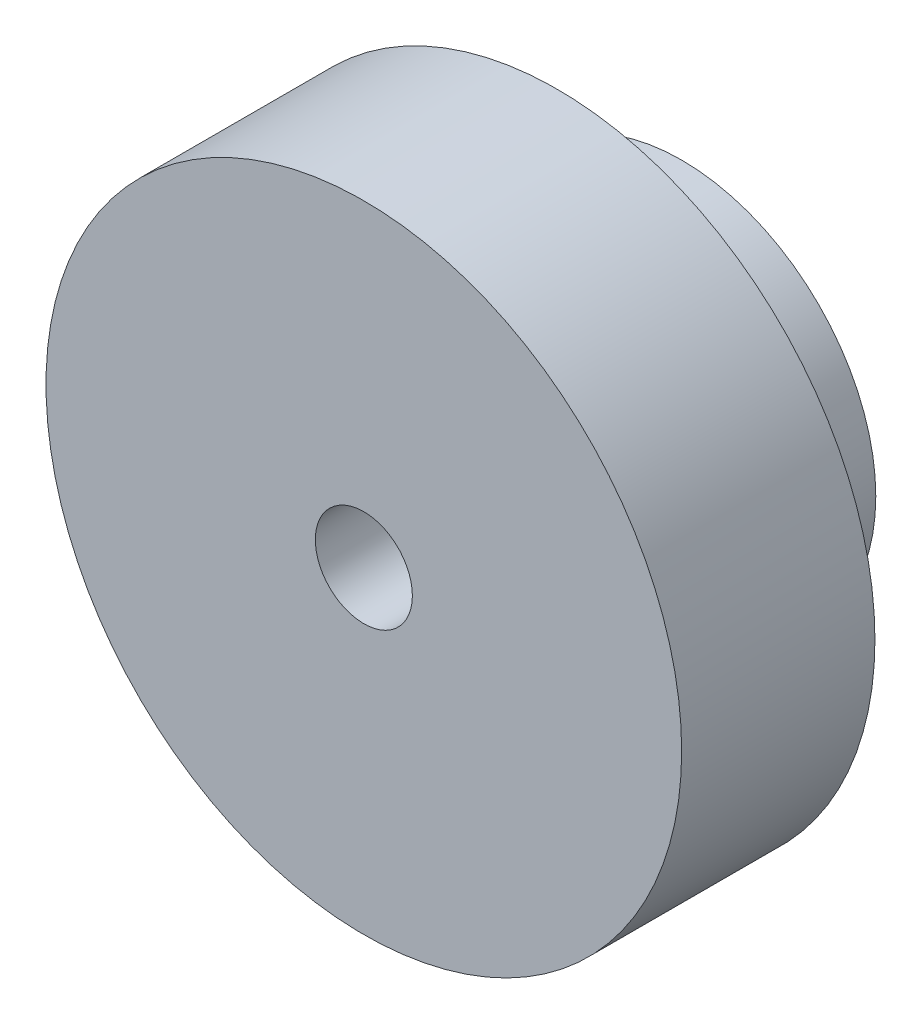
ISO-10303-21;
HEADER;
FILE_DESCRIPTION(('STEP AP214'),'2;1');
FILE_NAME('part.step','',(''),(''),'','','');
FILE_SCHEMA(('AUTOMOTIVE_DESIGN { 1 0 10303 214 1 1 1 1 }'));
ENDSEC;
DATA;
#1=APPLICATION_CONTEXT('core data for automotive mechanical design processes');
#2=APPLICATION_PROTOCOL_DEFINITION('international standard','automotive_design',2000,#1);
#3=PRODUCT_CONTEXT('',#1,'mechanical');
#4=PRODUCT('Part','Part','',(#3));
#5=PRODUCT_RELATED_PRODUCT_CATEGORY('part','',(#4));
#6=PRODUCT_DEFINITION_FORMATION('','',#4);
#7=PRODUCT_DEFINITION_CONTEXT('part definition',#1,'design');
#8=PRODUCT_DEFINITION('design','',#6,#7);
#9=PRODUCT_DEFINITION_SHAPE('','',#8);
#10=(LENGTH_UNIT() NAMED_UNIT(*) SI_UNIT(.MILLI.,.METRE.));
#11=(NAMED_UNIT(*) PLANE_ANGLE_UNIT() SI_UNIT($,.RADIAN.));
#12=(NAMED_UNIT(*) SI_UNIT($,.STERADIAN.) SOLID_ANGLE_UNIT());
#13=UNCERTAINTY_MEASURE_WITH_UNIT(LENGTH_MEASURE(1.E-05),#10,'distance_accuracy_value','');
#14=(GEOMETRIC_REPRESENTATION_CONTEXT(3) GLOBAL_UNCERTAINTY_ASSIGNED_CONTEXT((#13)) GLOBAL_UNIT_ASSIGNED_CONTEXT((#10,
#11,#12)) REPRESENTATION_CONTEXT('',''));
#15=CARTESIAN_POINT('',(0.,0.,0.));
#16=DIRECTION('',(0.,0.,1.));
#17=DIRECTION('',(1.,0.,0.));
#18=AXIS2_PLACEMENT_3D('',#15,#16,#17);
#19=CARTESIAN_POINT('',(0.,0.,0.));
#20=DIRECTION('',(0.,0.,1.));
#21=DIRECTION('',(1.,0.,0.));
#22=AXIS2_PLACEMENT_3D('',#19,#20,#21);
#23=PLANE('',#22);
#24=CARTESIAN_POINT('',(0.,0.,0.));
#25=DIRECTION('',(0.,0.,1.));
#26=DIRECTION('',(1.,0.,0.));
#27=AXIS2_PLACEMENT_3D('',#24,#25,#26);
#28=CIRCLE('',#27,9.398);
#29=CARTESIAN_POINT('',(9.398,0.,0.));
#30=VERTEX_POINT('',#29);
#31=EDGE_CURVE('E117',#30,#30,#28,.T.);
#32=ORIENTED_EDGE('',*,*,#31,.F.);
#33=EDGE_LOOP('',(#32));
#34=FACE_BOUND('',#33,.T.);
#35=CARTESIAN_POINT('',(0.,0.,0.));
#36=DIRECTION('',(0.,0.,1.));
#37=DIRECTION('',(1.,0.,0.));
#38=AXIS2_PLACEMENT_3D('',#35,#36,#37);
#39=CIRCLE('',#38,5.7404);
#40=CARTESIAN_POINT('',(5.7404,0.,0.));
#41=VERTEX_POINT('',#40);
#42=EDGE_CURVE('E11',#41,#41,#39,.F.);
#43=ORIENTED_EDGE('',*,*,#42,.F.);
#44=EDGE_LOOP('',(#43));
#45=FACE_BOUND('',#44,.T.);
#46=ADVANCED_FACE('F33',(#34,#45),#23,.F.);
#47=CARTESIAN_POINT('',(0.,0.,5.715));
#48=DIRECTION('',(0.,0.,1.));
#49=DIRECTION('',(1.,0.,0.));
#50=AXIS2_PLACEMENT_3D('',#47,#48,#49);
#51=PLANE('',#50);
#52=CARTESIAN_POINT('',(0.,0.,5.715));
#53=DIRECTION('',(0.,0.,1.));
#54=DIRECTION('',(1.,0.,0.));
#55=AXIS2_PLACEMENT_3D('',#52,#53,#54);
#56=CIRCLE('',#55,9.398);
#57=CARTESIAN_POINT('',(9.398,0.,5.715));
#58=VERTEX_POINT('',#57);
#59=EDGE_CURVE('E41',#58,#58,#56,.T.);
#60=ORIENTED_EDGE('',*,*,#59,.T.);
#61=EDGE_LOOP('',(#60));
#62=FACE_BOUND('',#61,.T.);
#63=CARTESIAN_POINT('',(0.,0.,5.715));
#64=DIRECTION('',(0.,0.,1.));
#65=DIRECTION('',(1.,0.,0.));
#66=AXIS2_PLACEMENT_3D('',#63,#64,#65);
#67=CIRCLE('',#66,1.4351);
#68=CARTESIAN_POINT('',(1.4351,0.,5.715));
#69=VERTEX_POINT('',#68);
#70=EDGE_CURVE('E114',#69,#69,#67,.T.);
#71=ORIENTED_EDGE('',*,*,#70,.F.);
#72=EDGE_LOOP('',(#71));
#73=FACE_BOUND('',#72,.T.);
#74=ADVANCED_FACE('F127',(#62,#73),#51,.T.);
#75=DIRECTION('',(-0.0568059995069936,0.998385235477775,0.));
#76=VECTOR('',#75,1.);
#77=CARTESIAN_POINT('',(-3.76439766377805,3.35908654150401,0.));
#78=LINE('',#77,#76);
#79=CARTESIAN_POINT('',(-3.35973996839416,-3.75291345849599,0.));
#80=VERTEX_POINT('',#79);
#81=CARTESIAN_POINT('',(-3.76439766377805,3.35908654150401,0.));
#82=VERTEX_POINT('',#81);
#83=EDGE_CURVE('E82',#80,#82,#78,.T.);
#84=ORIENTED_EDGE('',*,*,#83,.T.);
#85=DIRECTION('',(0.998385235477775,0.056805999506994,0.));
#86=VECTOR('',#85,1.);
#87=CARTESIAN_POINT('',(3.34760233622194,3.7637442368879,0.));
#88=LINE('',#87,#86);
#89=CARTESIAN_POINT('',(3.34760233622194,3.7637442368879,0.));
#90=VERTEX_POINT('',#89);
#91=EDGE_CURVE('E100',#82,#90,#88,.T.);
#92=ORIENTED_EDGE('',*,*,#91,.T.);
#93=DIRECTION('',(0.0568059995069942,-0.998385235477774,0.));
#94=VECTOR('',#93,1.);
#95=CARTESIAN_POINT('',(3.75226003160584,-3.3482557631121,0.));
#96=LINE('',#95,#94);
#97=CARTESIAN_POINT('',(3.75226003160584,-3.3482557631121,0.));
#98=VERTEX_POINT('',#97);
#99=EDGE_CURVE('E88',#90,#98,#96,.T.);
#100=ORIENTED_EDGE('',*,*,#99,.T.);
#101=DIRECTION('',(-0.998385235477775,-0.0568059995069939,0.));
#102=VECTOR('',#101,1.);
#103=CARTESIAN_POINT('',(-3.35973996839416,-3.75291345849599,0.));
#104=LINE('',#103,#102);
#105=EDGE_CURVE('E103',#98,#80,#104,.T.);
#106=ORIENTED_EDGE('',*,*,#105,.T.);
#107=EDGE_LOOP('',(#84,#92,#100,#106));
#108=FACE_BOUND('',#107,.T.);
#109=CARTESIAN_POINT('',(0.,0.,0.));
#110=DIRECTION('',(0.,0.,1.));
#111=DIRECTION('',(1.,0.,0.));
#112=AXIS2_PLACEMENT_3D('',#109,#110,#111);
#113=CIRCLE('',#112,1.4351);
#114=CARTESIAN_POINT('',(1.4351,0.,0.));
#115=VERTEX_POINT('',#114);
#116=EDGE_CURVE('E113',#115,#115,#113,.T.);
#117=ORIENTED_EDGE('',*,*,#116,.T.);
#118=EDGE_LOOP('',(#117));
#119=FACE_BOUND('',#118,.T.);
#120=ADVANCED_FACE('F128',(#108,#119),#23,.F.);
#121=CARTESIAN_POINT('',(0.,0.,5.715));
#122=DIRECTION('',(0.,0.,-1.));
#123=DIRECTION('',(-1.,0.,0.));
#124=AXIS2_PLACEMENT_3D('',#121,#122,#123);
#125=CYLINDRICAL_SURFACE('',#124,9.398);
#126=ORIENTED_EDGE('',*,*,#59,.F.);
#127=EDGE_LOOP('',(#126));
#128=FACE_BOUND('',#127,.T.);
#129=ORIENTED_EDGE('',*,*,#31,.T.);
#130=EDGE_LOOP('',(#129));
#131=FACE_BOUND('',#130,.T.);
#132=ADVANCED_FACE('F35',(#128,#131),#125,.T.);
#133=CARTESIAN_POINT('',(0.,0.,5.715));
#134=DIRECTION('',(0.,0.,-1.));
#135=DIRECTION('',(-1.,0.,0.));
#136=AXIS2_PLACEMENT_3D('',#133,#134,#135);
#137=CYLINDRICAL_SURFACE('',#136,1.4351);
#138=ORIENTED_EDGE('',*,*,#70,.T.);
#139=EDGE_LOOP('',(#138));
#140=FACE_BOUND('',#139,.T.);
#141=ORIENTED_EDGE('',*,*,#116,.F.);
#142=EDGE_LOOP('',(#141));
#143=FACE_BOUND('',#142,.T.);
#144=ADVANCED_FACE('F140',(#140,#143),#137,.F.);
#145=CARTESIAN_POINT('',(0.,0.,-3.683));
#146=DIRECTION('',(0.,0.,-1.));
#147=DIRECTION('',(-1.,0.,0.));
#148=AXIS2_PLACEMENT_3D('',#145,#146,#147);
#149=PLANE('',#148);
#150=CARTESIAN_POINT('',(0.,0.,-3.683));
#151=DIRECTION('',(0.,0.,-1.));
#152=DIRECTION('',(-1.,0.,0.));
#153=AXIS2_PLACEMENT_3D('',#150,#151,#152);
#154=CIRCLE('',#153,5.7404);
#155=CARTESIAN_POINT('',(-5.7404,0.,-3.683));
#156=VERTEX_POINT('',#155);
#157=EDGE_CURVE('E89',#156,#156,#154,.T.);
#158=ORIENTED_EDGE('',*,*,#157,.T.);
#159=EDGE_LOOP('',(#158));
#160=FACE_BOUND('',#159,.T.);
#161=DIRECTION('',(0.0568059995069942,-0.998385235477774,0.));
#162=VECTOR('',#161,1.);
#163=CARTESIAN_POINT('',(3.75226003160584,-3.3482557631121,-3.683));
#164=LINE('',#163,#162);
#165=CARTESIAN_POINT('',(3.34760233622194,3.7637442368879,-3.683));
#166=VERTEX_POINT('',#165);
#167=CARTESIAN_POINT('',(3.75226003160584,-3.3482557631121,-3.683));
#168=VERTEX_POINT('',#167);
#169=EDGE_CURVE('E81',#166,#168,#164,.T.);
#170=ORIENTED_EDGE('',*,*,#169,.F.);
#171=DIRECTION('',(0.998385235477775,0.056805999506994,0.));
#172=VECTOR('',#171,1.);
#173=CARTESIAN_POINT('',(3.34760233622194,3.7637442368879,-3.683));
#174=LINE('',#173,#172);
#175=CARTESIAN_POINT('',(-3.76439766377805,3.35908654150401,-3.683));
#176=VERTEX_POINT('',#175);
#177=EDGE_CURVE('E73',#176,#166,#174,.T.);
#178=ORIENTED_EDGE('',*,*,#177,.F.);
#179=DIRECTION('',(-0.0568059995069936,0.998385235477775,0.));
#180=VECTOR('',#179,1.);
#181=CARTESIAN_POINT('',(-3.76439766377805,3.35908654150401,-3.683));
#182=LINE('',#181,#180);
#183=CARTESIAN_POINT('',(-3.35973996839416,-3.75291345849599,-3.683));
#184=VERTEX_POINT('',#183);
#185=EDGE_CURVE('E96',#184,#176,#182,.T.);
#186=ORIENTED_EDGE('',*,*,#185,.F.);
#187=DIRECTION('',(-0.998385235477775,-0.0568059995069939,0.));
#188=VECTOR('',#187,1.);
#189=CARTESIAN_POINT('',(-3.35973996839416,-3.75291345849599,-3.683));
#190=LINE('',#189,#188);
#191=EDGE_CURVE('E94',#168,#184,#190,.T.);
#192=ORIENTED_EDGE('',*,*,#191,.F.);
#193=EDGE_LOOP('',(#170,#178,#186,#192));
#194=FACE_BOUND('',#193,.T.);
#195=ADVANCED_FACE('F93',(#160,#194),#149,.T.);
#196=CARTESIAN_POINT('',(0.,0.,-3.683));
#197=DIRECTION('',(0.,0.,1.));
#198=DIRECTION('',(1.,0.,0.));
#199=AXIS2_PLACEMENT_3D('',#196,#197,#198);
#200=CYLINDRICAL_SURFACE('',#199,5.7404);
#201=ORIENTED_EDGE('',*,*,#157,.F.);
#202=EDGE_LOOP('',(#201));
#203=FACE_BOUND('',#202,.T.);
#204=ORIENTED_EDGE('',*,*,#42,.T.);
#205=EDGE_LOOP('',(#204));
#206=FACE_BOUND('',#205,.T.);
#207=ADVANCED_FACE('F131',(#203,#206),#200,.T.);
#208=CARTESIAN_POINT('',(3.34760233622194,3.7637442368879,-3.683));
#209=DIRECTION('',(0.056805999506994,-0.998385235477775,0.));
#210=DIRECTION('',(0.998385235477775,0.056805999506994,0.));
#211=AXIS2_PLACEMENT_3D('',#208,#209,#210);
#212=PLANE('',#211);
#213=ORIENTED_EDGE('',*,*,#91,.F.);
#214=DIRECTION('',(0.,0.,1.));
#215=VECTOR('',#214,1.);
#216=CARTESIAN_POINT('',(-3.76439766377805,3.35908654150401,-3.683));
#217=LINE('',#216,#215);
#218=EDGE_CURVE('E48',#176,#82,#217,.T.);
#219=ORIENTED_EDGE('',*,*,#218,.F.);
#220=ORIENTED_EDGE('',*,*,#177,.T.);
#221=DIRECTION('',(0.,0.,1.));
#222=VECTOR('',#221,1.);
#223=CARTESIAN_POINT('',(3.34760233622194,3.7637442368879,-3.683));
#224=LINE('',#223,#222);
#225=EDGE_CURVE('E76',#166,#90,#224,.T.);
#226=ORIENTED_EDGE('',*,*,#225,.T.);
#227=EDGE_LOOP('',(#213,#219,#220,#226));
#228=FACE_BOUND('',#227,.T.);
#229=ADVANCED_FACE('F75',(#228),#212,.T.);
#230=CARTESIAN_POINT('',(3.75226003160584,-3.3482557631121,-3.683));
#231=DIRECTION('',(-0.998385235477775,-0.0568059995069942,0.));
#232=DIRECTION('',(0.0568059995069942,-0.998385235477775,0.));
#233=AXIS2_PLACEMENT_3D('',#230,#231,#232);
#234=PLANE('',#233);
#235=ORIENTED_EDGE('',*,*,#99,.F.);
#236=ORIENTED_EDGE('',*,*,#225,.F.);
#237=ORIENTED_EDGE('',*,*,#169,.T.);
#238=DIRECTION('',(0.,0.,1.));
#239=VECTOR('',#238,1.);
#240=CARTESIAN_POINT('',(3.75226003160584,-3.3482557631121,-3.683));
#241=LINE('',#240,#239);
#242=EDGE_CURVE('E90',#168,#98,#241,.T.);
#243=ORIENTED_EDGE('',*,*,#242,.T.);
#244=EDGE_LOOP('',(#235,#236,#237,#243));
#245=FACE_BOUND('',#244,.T.);
#246=ADVANCED_FACE('F85',(#245),#234,.T.);
#247=CARTESIAN_POINT('',(-3.35973996839416,-3.75291345849599,-3.683));
#248=DIRECTION('',(-0.0568059995069939,0.998385235477775,0.));
#249=DIRECTION('',(-0.998385235477775,-0.0568059995069939,0.));
#250=AXIS2_PLACEMENT_3D('',#247,#248,#249);
#251=PLANE('',#250);
#252=ORIENTED_EDGE('',*,*,#105,.F.);
#253=ORIENTED_EDGE('',*,*,#242,.F.);
#254=ORIENTED_EDGE('',*,*,#191,.T.);
#255=DIRECTION('',(0.,0.,1.));
#256=VECTOR('',#255,1.);
#257=CARTESIAN_POINT('',(-3.35973996839416,-3.75291345849599,-3.683));
#258=LINE('',#257,#256);
#259=EDGE_CURVE('E53',#184,#80,#258,.T.);
#260=ORIENTED_EDGE('',*,*,#259,.T.);
#261=EDGE_LOOP('',(#252,#253,#254,#260));
#262=FACE_BOUND('',#261,.T.);
#263=ADVANCED_FACE('F162',(#262),#251,.T.);
#264=CARTESIAN_POINT('',(-3.76439766377805,3.35908654150401,-3.683));
#265=DIRECTION('',(0.998385235477775,0.0568059995069936,0.));
#266=DIRECTION('',(-0.0568059995069936,0.998385235477775,0.));
#267=AXIS2_PLACEMENT_3D('',#264,#265,#266);
#268=PLANE('',#267);
#269=ORIENTED_EDGE('',*,*,#83,.F.);
#270=ORIENTED_EDGE('',*,*,#259,.F.);
#271=ORIENTED_EDGE('',*,*,#185,.T.);
#272=ORIENTED_EDGE('',*,*,#218,.T.);
#273=EDGE_LOOP('',(#269,#270,#271,#272));
#274=FACE_BOUND('',#273,.T.);
#275=ADVANCED_FACE('F160',(#274),#268,.T.);
#276=CLOSED_SHELL('',(#46,#74,#120,#132,#144,#195,#207,#229,#246,#263,#275));
#277=MANIFOLD_SOLID_BREP('B2',#276);
#278=ADVANCED_BREP_SHAPE_REPRESENTATION('',(#18,#277),#14);
#279=SHAPE_DEFINITION_REPRESENTATION(#9,#278);
ENDSEC;
END-ISO-10303-21;
